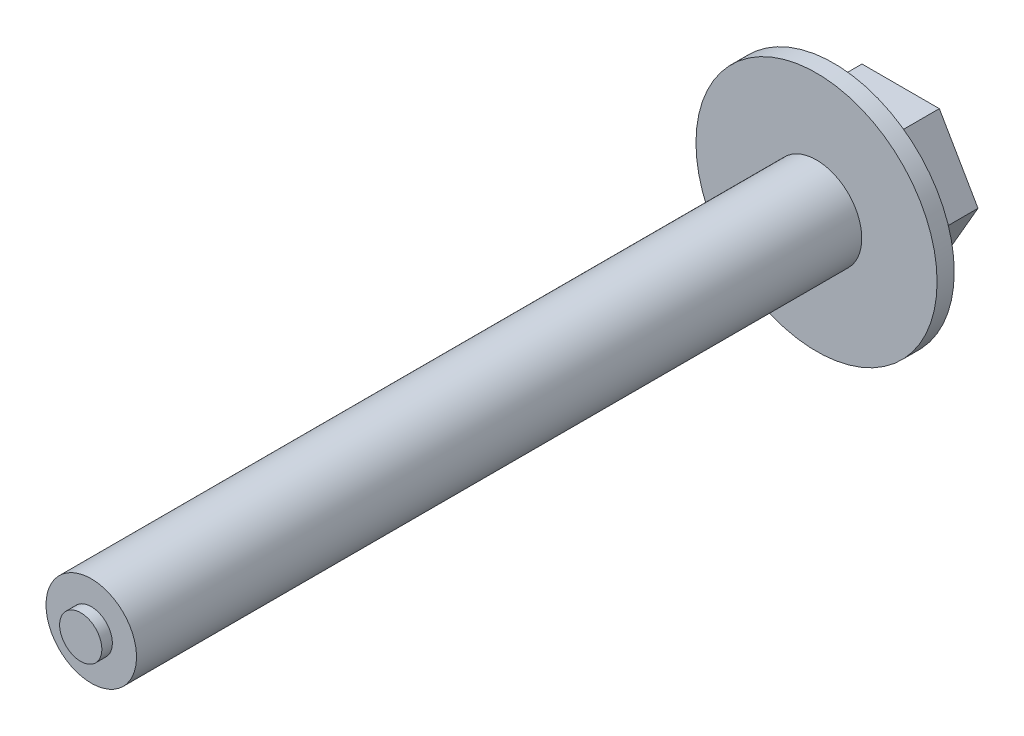
ISO-10303-21;
HEADER;
FILE_DESCRIPTION(('STEP AP214'),'2;1');
FILE_NAME('part.step','',(''),(''),'','','');
FILE_SCHEMA(('AUTOMOTIVE_DESIGN { 1 0 10303 214 1 1 1 1 }'));
ENDSEC;
DATA;
#1=APPLICATION_CONTEXT('core data for automotive mechanical design processes');
#2=APPLICATION_PROTOCOL_DEFINITION('international standard','automotive_design',2000,#1);
#3=PRODUCT_CONTEXT('',#1,'mechanical');
#4=PRODUCT('Part','Part','',(#3));
#5=PRODUCT_RELATED_PRODUCT_CATEGORY('part','',(#4));
#6=PRODUCT_DEFINITION_FORMATION('','',#4);
#7=PRODUCT_DEFINITION_CONTEXT('part definition',#1,'design');
#8=PRODUCT_DEFINITION('design','',#6,#7);
#9=PRODUCT_DEFINITION_SHAPE('','',#8);
#10=(LENGTH_UNIT() NAMED_UNIT(*) SI_UNIT(.MILLI.,.METRE.));
#11=(NAMED_UNIT(*) PLANE_ANGLE_UNIT() SI_UNIT($,.RADIAN.));
#12=(NAMED_UNIT(*) SI_UNIT($,.STERADIAN.) SOLID_ANGLE_UNIT());
#13=UNCERTAINTY_MEASURE_WITH_UNIT(LENGTH_MEASURE(1.E-05),#10,'distance_accuracy_value','');
#14=(GEOMETRIC_REPRESENTATION_CONTEXT(3) GLOBAL_UNCERTAINTY_ASSIGNED_CONTEXT((#13)) GLOBAL_UNIT_ASSIGNED_CONTEXT((#10,
#11,#12)) REPRESENTATION_CONTEXT('',''));
#15=CARTESIAN_POINT('',(0.,0.,0.));
#16=DIRECTION('',(0.,0.,1.));
#17=DIRECTION('',(1.,0.,0.));
#18=AXIS2_PLACEMENT_3D('',#15,#16,#17);
#19=CARTESIAN_POINT('',(1.8330871046771,-3.17499999999998,3.175));
#20=DIRECTION('',(-0.866025403784441,0.499999999999995,0.));
#21=DIRECTION('',(-0.499999999999995,-0.866025403784441,0.));
#22=AXIS2_PLACEMENT_3D('',#19,#20,#21);
#23=PLANE('',#22);
#24=DIRECTION('',(0.499999999999995,0.866025403784441,0.));
#25=VECTOR('',#24,1.);
#26=CARTESIAN_POINT('',(1.8330871046771,-3.17499999999998,0.));
#27=LINE('',#26,#25);
#28=CARTESIAN_POINT('',(1.8330871046771,-3.17499999999998,0.));
#29=VERTEX_POINT('',#28);
#30=CARTESIAN_POINT('',(3.66617420935413,0.,0.));
#31=VERTEX_POINT('',#30);
#32=EDGE_CURVE('E143',#29,#31,#27,.T.);
#33=ORIENTED_EDGE('',*,*,#32,.T.);
#34=DIRECTION('',(0.,0.,-1.));
#35=VECTOR('',#34,1.);
#36=CARTESIAN_POINT('',(3.66617420935413,0.,3.175));
#37=LINE('',#36,#35);
#38=CARTESIAN_POINT('',(3.66617420935413,0.,3.175));
#39=VERTEX_POINT('',#38);
#40=EDGE_CURVE('E11',#39,#31,#37,.T.);
#41=ORIENTED_EDGE('',*,*,#40,.F.);
#42=DIRECTION('',(0.499999999999995,0.866025403784441,0.));
#43=VECTOR('',#42,1.);
#44=CARTESIAN_POINT('',(1.8330871046771,-3.17499999999998,3.175));
#45=LINE('',#44,#43);
#46=CARTESIAN_POINT('',(1.8330871046771,-3.17499999999998,3.175));
#47=VERTEX_POINT('',#46);
#48=EDGE_CURVE('E133',#47,#39,#45,.T.);
#49=ORIENTED_EDGE('',*,*,#48,.F.);
#50=DIRECTION('',(0.,0.,-1.));
#51=VECTOR('',#50,1.);
#52=CARTESIAN_POINT('',(1.8330871046771,-3.17499999999998,3.175));
#53=LINE('',#52,#51);
#54=EDGE_CURVE('E142',#47,#29,#53,.T.);
#55=ORIENTED_EDGE('',*,*,#54,.T.);
#56=EDGE_LOOP('',(#33,#41,#49,#55));
#57=FACE_BOUND('',#56,.T.);
#58=ADVANCED_FACE('F44',(#57),#23,.F.);
#59=CARTESIAN_POINT('',(3.66617420935413,0.,3.175));
#60=DIRECTION('',(-0.866025403784438,-0.500000000000001,0.));
#61=DIRECTION('',(0.500000000000001,-0.866025403784438,0.));
#62=AXIS2_PLACEMENT_3D('',#59,#60,#61);
#63=PLANE('',#62);
#64=DIRECTION('',(-0.500000000000001,0.866025403784438,0.));
#65=VECTOR('',#64,1.);
#66=CARTESIAN_POINT('',(3.66617420935413,0.,0.));
#67=LINE('',#66,#65);
#68=CARTESIAN_POINT('',(1.83308710467706,3.17500000000001,0.));
#69=VERTEX_POINT('',#68);
#70=EDGE_CURVE('E147',#31,#69,#67,.T.);
#71=ORIENTED_EDGE('',*,*,#70,.T.);
#72=DIRECTION('',(0.,0.,-1.));
#73=VECTOR('',#72,1.);
#74=CARTESIAN_POINT('',(1.83308710467706,3.17500000000001,3.175));
#75=LINE('',#74,#73);
#76=CARTESIAN_POINT('',(1.83308710467706,3.17500000000001,3.175));
#77=VERTEX_POINT('',#76);
#78=EDGE_CURVE('E54',#77,#69,#75,.T.);
#79=ORIENTED_EDGE('',*,*,#78,.F.);
#80=DIRECTION('',(-0.500000000000001,0.866025403784438,0.));
#81=VECTOR('',#80,1.);
#82=CARTESIAN_POINT('',(3.66617420935413,0.,3.175));
#83=LINE('',#82,#81);
#84=EDGE_CURVE('E98',#39,#77,#83,.T.);
#85=ORIENTED_EDGE('',*,*,#84,.F.);
#86=ORIENTED_EDGE('',*,*,#40,.T.);
#87=EDGE_LOOP('',(#71,#79,#85,#86));
#88=FACE_BOUND('',#87,.T.);
#89=ADVANCED_FACE('F215',(#88),#63,.F.);
#90=CARTESIAN_POINT('',(1.83308710467706,3.17500000000001,3.175));
#91=DIRECTION('',(0.,-1.,0.));
#92=DIRECTION('',(1.,0.,0.));
#93=AXIS2_PLACEMENT_3D('',#90,#91,#92);
#94=PLANE('',#93);
#95=DIRECTION('',(-1.,0.,0.));
#96=VECTOR('',#95,1.);
#97=CARTESIAN_POINT('',(1.83308710467706,3.17500000000001,0.));
#98=LINE('',#97,#96);
#99=CARTESIAN_POINT('',(-1.83308710467708,3.17499999999999,0.));
#100=VERTEX_POINT('',#99);
#101=EDGE_CURVE('E113',#69,#100,#98,.T.);
#102=ORIENTED_EDGE('',*,*,#101,.T.);
#103=DIRECTION('',(0.,0.,-1.));
#104=VECTOR('',#103,1.);
#105=CARTESIAN_POINT('',(-1.83308710467708,3.17499999999999,3.175));
#106=LINE('',#105,#104);
#107=CARTESIAN_POINT('',(-1.83308710467708,3.17499999999999,3.175));
#108=VERTEX_POINT('',#107);
#109=EDGE_CURVE('E106',#108,#100,#106,.T.);
#110=ORIENTED_EDGE('',*,*,#109,.F.);
#111=DIRECTION('',(-1.,0.,0.));
#112=VECTOR('',#111,1.);
#113=CARTESIAN_POINT('',(1.83308710467706,3.17500000000001,3.175));
#114=LINE('',#113,#112);
#115=EDGE_CURVE('E111',#77,#108,#114,.T.);
#116=ORIENTED_EDGE('',*,*,#115,.F.);
#117=ORIENTED_EDGE('',*,*,#78,.T.);
#118=EDGE_LOOP('',(#102,#110,#116,#117));
#119=FACE_BOUND('',#118,.T.);
#120=ADVANCED_FACE('F108',(#119),#94,.F.);
#121=CARTESIAN_POINT('',(-1.83308710467708,3.17499999999999,3.175));
#122=DIRECTION('',(0.866025403784441,-0.499999999999995,0.));
#123=DIRECTION('',(0.499999999999995,0.866025403784442,0.));
#124=AXIS2_PLACEMENT_3D('',#121,#122,#123);
#125=PLANE('',#124);
#126=DIRECTION('',(-0.499999999999995,-0.866025403784441,0.));
#127=VECTOR('',#126,1.);
#128=CARTESIAN_POINT('',(-1.83308710467708,3.17499999999999,0.));
#129=LINE('',#128,#127);
#130=CARTESIAN_POINT('',(-3.66617420935413,0.,0.));
#131=VERTEX_POINT('',#130);
#132=EDGE_CURVE('E153',#100,#131,#129,.T.);
#133=ORIENTED_EDGE('',*,*,#132,.T.);
#134=DIRECTION('',(0.,0.,-1.));
#135=VECTOR('',#134,1.);
#136=CARTESIAN_POINT('',(-3.66617420935413,0.,3.175));
#137=LINE('',#136,#135);
#138=CARTESIAN_POINT('',(-3.66617420935413,0.,3.175));
#139=VERTEX_POINT('',#138);
#140=EDGE_CURVE('E117',#139,#131,#137,.T.);
#141=ORIENTED_EDGE('',*,*,#140,.F.);
#142=DIRECTION('',(-0.499999999999995,-0.866025403784441,0.));
#143=VECTOR('',#142,1.);
#144=CARTESIAN_POINT('',(-1.83308710467708,3.17499999999999,3.175));
#145=LINE('',#144,#143);
#146=EDGE_CURVE('E120',#108,#139,#145,.T.);
#147=ORIENTED_EDGE('',*,*,#146,.F.);
#148=ORIENTED_EDGE('',*,*,#109,.T.);
#149=EDGE_LOOP('',(#133,#141,#147,#148));
#150=FACE_BOUND('',#149,.T.);
#151=ADVANCED_FACE('F121',(#150),#125,.F.);
#152=CARTESIAN_POINT('',(-3.66617420935413,0.,3.175));
#153=DIRECTION('',(0.866025403784435,0.500000000000007,0.));
#154=DIRECTION('',(-0.500000000000007,0.866025403784435,0.));
#155=AXIS2_PLACEMENT_3D('',#152,#153,#154);
#156=PLANE('',#155);
#157=DIRECTION('',(0.500000000000007,-0.866025403784435,0.));
#158=VECTOR('',#157,1.);
#159=CARTESIAN_POINT('',(-3.66617420935413,0.,0.));
#160=LINE('',#159,#158);
#161=CARTESIAN_POINT('',(-1.83308710467703,-3.17500000000002,0.));
#162=VERTEX_POINT('',#161);
#163=EDGE_CURVE('E84',#131,#162,#160,.T.);
#164=ORIENTED_EDGE('',*,*,#163,.T.);
#165=DIRECTION('',(0.,0.,-1.));
#166=VECTOR('',#165,1.);
#167=CARTESIAN_POINT('',(-1.83308710467703,-3.17500000000002,3.175));
#168=LINE('',#167,#166);
#169=CARTESIAN_POINT('',(-1.83308710467703,-3.17500000000002,3.175));
#170=VERTEX_POINT('',#169);
#171=EDGE_CURVE('E62',#170,#162,#168,.T.);
#172=ORIENTED_EDGE('',*,*,#171,.F.);
#173=DIRECTION('',(0.500000000000007,-0.866025403784435,0.));
#174=VECTOR('',#173,1.);
#175=CARTESIAN_POINT('',(-3.66617420935413,0.,3.175));
#176=LINE('',#175,#174);
#177=EDGE_CURVE('E125',#139,#170,#176,.T.);
#178=ORIENTED_EDGE('',*,*,#177,.F.);
#179=ORIENTED_EDGE('',*,*,#140,.T.);
#180=EDGE_LOOP('',(#164,#172,#178,#179));
#181=FACE_BOUND('',#180,.T.);
#182=ADVANCED_FACE('F170',(#181),#156,.F.);
#183=CARTESIAN_POINT('',(-1.83308710467703,-3.17500000000002,3.175));
#184=DIRECTION('',(0.,1.,0.));
#185=DIRECTION('',(-1.,0.,0.));
#186=AXIS2_PLACEMENT_3D('',#183,#184,#185);
#187=PLANE('',#186);
#188=DIRECTION('',(1.,0.,0.));
#189=VECTOR('',#188,1.);
#190=CARTESIAN_POINT('',(-1.83308710467703,-3.17500000000002,0.));
#191=LINE('',#190,#189);
#192=EDGE_CURVE('E90',#162,#29,#191,.T.);
#193=ORIENTED_EDGE('',*,*,#192,.T.);
#194=ORIENTED_EDGE('',*,*,#54,.F.);
#195=DIRECTION('',(1.,0.,0.));
#196=VECTOR('',#195,1.);
#197=CARTESIAN_POINT('',(-1.83308710467703,-3.17500000000002,3.175));
#198=LINE('',#197,#196);
#199=EDGE_CURVE('E139',#170,#47,#198,.T.);
#200=ORIENTED_EDGE('',*,*,#199,.F.);
#201=ORIENTED_EDGE('',*,*,#171,.T.);
#202=EDGE_LOOP('',(#193,#194,#200,#201));
#203=FACE_BOUND('',#202,.T.);
#204=ADVANCED_FACE('F172',(#203),#187,.F.);
#205=CARTESIAN_POINT('',(0.,0.,0.));
#206=DIRECTION('',(0.,0.,1.));
#207=DIRECTION('',(1.,0.,0.));
#208=AXIS2_PLACEMENT_3D('',#205,#206,#207);
#209=PLANE('',#208);
#210=ORIENTED_EDGE('',*,*,#32,.F.);
#211=ORIENTED_EDGE('',*,*,#192,.F.);
#212=ORIENTED_EDGE('',*,*,#163,.F.);
#213=ORIENTED_EDGE('',*,*,#132,.F.);
#214=ORIENTED_EDGE('',*,*,#101,.F.);
#215=ORIENTED_EDGE('',*,*,#70,.F.);
#216=EDGE_LOOP('',(#210,#211,#212,#213,#214,#215));
#217=FACE_BOUND('',#216,.T.);
#218=ADVANCED_FACE('F169',(#217),#209,.F.);
#219=CARTESIAN_POINT('',(0.,0.,3.175));
#220=DIRECTION('',(0.,0.,1.));
#221=DIRECTION('',(1.,0.,0.));
#222=AXIS2_PLACEMENT_3D('',#219,#220,#221);
#223=PLANE('',#222);
#224=CARTESIAN_POINT('',(0.,0.,3.175));
#225=DIRECTION('',(0.,0.,1.));
#226=DIRECTION('',(1.,0.,0.));
#227=AXIS2_PLACEMENT_3D('',#224,#225,#226);
#228=CIRCLE('',#227,5.715);
#229=CARTESIAN_POINT('',(5.715,0.,3.175));
#230=VERTEX_POINT('',#229);
#231=EDGE_CURVE('E176',#230,#230,#228,.T.);
#232=ORIENTED_EDGE('',*,*,#231,.F.);
#233=EDGE_LOOP('',(#232));
#234=FACE_BOUND('',#233,.T.);
#235=ORIENTED_EDGE('',*,*,#199,.T.);
#236=ORIENTED_EDGE('',*,*,#48,.T.);
#237=ORIENTED_EDGE('',*,*,#84,.T.);
#238=ORIENTED_EDGE('',*,*,#115,.T.);
#239=ORIENTED_EDGE('',*,*,#146,.T.);
#240=ORIENTED_EDGE('',*,*,#177,.T.);
#241=EDGE_LOOP('',(#235,#236,#237,#238,#239,#240));
#242=FACE_BOUND('',#241,.T.);
#243=ADVANCED_FACE('F128',(#234,#242),#223,.F.);
#244=CARTESIAN_POINT('',(0.,0.,3.9878));
#245=DIRECTION('',(0.,0.,-1.));
#246=DIRECTION('',(-1.,0.,0.));
#247=AXIS2_PLACEMENT_3D('',#244,#245,#246);
#248=CYLINDRICAL_SURFACE('',#247,5.715);
#249=CARTESIAN_POINT('',(0.,0.,3.9878));
#250=DIRECTION('',(0.,0.,1.));
#251=DIRECTION('',(1.,0.,0.));
#252=AXIS2_PLACEMENT_3D('',#249,#250,#251);
#253=CIRCLE('',#252,5.715);
#254=CARTESIAN_POINT('',(5.715,0.,3.9878));
#255=VERTEX_POINT('',#254);
#256=EDGE_CURVE('E148',#255,#255,#253,.T.);
#257=ORIENTED_EDGE('',*,*,#256,.F.);
#258=EDGE_LOOP('',(#257));
#259=FACE_BOUND('',#258,.T.);
#260=ORIENTED_EDGE('',*,*,#231,.T.);
#261=EDGE_LOOP('',(#260));
#262=FACE_BOUND('',#261,.T.);
#263=ADVANCED_FACE('F232',(#259,#262),#248,.T.);
#264=CARTESIAN_POINT('',(0.,0.,3.9878));
#265=DIRECTION('',(0.,0.,1.));
#266=DIRECTION('',(1.,0.,0.));
#267=AXIS2_PLACEMENT_3D('',#264,#265,#266);
#268=PLANE('',#267);
#269=CARTESIAN_POINT('',(0.,0.,3.9878));
#270=DIRECTION('',(0.,0.,-1.));
#271=DIRECTION('',(-1.,0.,0.));
#272=AXIS2_PLACEMENT_3D('',#269,#270,#271);
#273=CIRCLE('',#272,2.145);
#274=CARTESIAN_POINT('',(-2.145,0.,3.9878));
#275=VERTEX_POINT('',#274);
#276=EDGE_CURVE('E180',#275,#275,#273,.T.);
#277=ORIENTED_EDGE('',*,*,#276,.T.);
#278=EDGE_LOOP('',(#277));
#279=FACE_BOUND('',#278,.T.);
#280=ORIENTED_EDGE('',*,*,#256,.T.);
#281=EDGE_LOOP('',(#280));
#282=FACE_BOUND('',#281,.T.);
#283=ADVANCED_FACE('F235',(#279,#282),#268,.T.);
#284=CARTESIAN_POINT('',(0.,0.,3.9878));
#285=DIRECTION('',(0.,0.,-1.));
#286=DIRECTION('',(-1.,0.,0.));
#287=AXIS2_PLACEMENT_3D('',#284,#285,#286);
#288=CYLINDRICAL_SURFACE('',#287,2.145);
#289=CARTESIAN_POINT('',(0.,0.,38.3678));
#290=DIRECTION('',(0.,0.,-1.));
#291=DIRECTION('',(-1.,0.,0.));
#292=AXIS2_PLACEMENT_3D('',#289,#290,#291);
#293=CIRCLE('',#292,2.145);
#294=CARTESIAN_POINT('',(-2.145,0.,38.3678));
#295=VERTEX_POINT('',#294);
#296=EDGE_CURVE('E187',#295,#295,#293,.T.);
#297=ORIENTED_EDGE('',*,*,#296,.T.);
#298=EDGE_LOOP('',(#297));
#299=FACE_BOUND('',#298,.T.);
#300=ORIENTED_EDGE('',*,*,#276,.F.);
#301=EDGE_LOOP('',(#300));
#302=FACE_BOUND('',#301,.T.);
#303=ADVANCED_FACE('F212',(#299,#302),#288,.T.);
#304=CARTESIAN_POINT('',(0.,2.145,38.3678));
#305=DIRECTION('',(0.,0.,1.));
#306=DIRECTION('',(1.,0.,0.));
#307=AXIS2_PLACEMENT_3D('',#304,#305,#306);
#308=PLANE('',#307);
#309=CARTESIAN_POINT('',(0.,0.,38.3678));
#310=DIRECTION('',(0.,0.,-1.));
#311=DIRECTION('',(-1.,0.,0.));
#312=AXIS2_PLACEMENT_3D('',#309,#310,#311);
#313=CIRCLE('',#312,0.999999999999996);
#314=CARTESIAN_POINT('',(-0.999999999999996,0.,38.3678));
#315=VERTEX_POINT('',#314);
#316=EDGE_CURVE('E191',#315,#315,#313,.T.);
#317=ORIENTED_EDGE('',*,*,#316,.T.);
#318=EDGE_LOOP('',(#317));
#319=FACE_BOUND('',#318,.T.);
#320=ORIENTED_EDGE('',*,*,#296,.F.);
#321=EDGE_LOOP('',(#320));
#322=FACE_BOUND('',#321,.T.);
#323=ADVANCED_FACE('F205',(#319,#322),#308,.T.);
#324=CARTESIAN_POINT('',(0.,0.,3.9878));
#325=DIRECTION('',(0.,0.,-1.));
#326=DIRECTION('',(-1.,0.,0.));
#327=AXIS2_PLACEMENT_3D('',#324,#325,#326);
#328=CYLINDRICAL_SURFACE('',#327,0.999999999999996);
#329=CARTESIAN_POINT('',(0.,0.,38.8678));
#330=DIRECTION('',(0.,0.,-1.));
#331=DIRECTION('',(-1.,0.,0.));
#332=AXIS2_PLACEMENT_3D('',#329,#330,#331);
#333=CIRCLE('',#332,0.999999999999996);
#334=CARTESIAN_POINT('',(-0.999999999999996,0.,38.8678));
#335=VERTEX_POINT('',#334);
#336=EDGE_CURVE('E47',#335,#335,#333,.F.);
#337=ORIENTED_EDGE('',*,*,#336,.F.);
#338=EDGE_LOOP('',(#337));
#339=FACE_BOUND('',#338,.T.);
#340=ORIENTED_EDGE('',*,*,#316,.F.);
#341=EDGE_LOOP('',(#340));
#342=FACE_BOUND('',#341,.T.);
#343=ADVANCED_FACE('F202',(#339,#342),#328,.T.);
#344=CARTESIAN_POINT('',(-5.715,3.,38.8678));
#345=DIRECTION('',(0.,0.,-1.));
#346=DIRECTION('',(-1.,0.,0.));
#347=AXIS2_PLACEMENT_3D('',#344,#345,#346);
#348=PLANE('',#347);
#349=ORIENTED_EDGE('',*,*,#336,.T.);
#350=EDGE_LOOP('',(#349));
#351=FACE_BOUND('',#350,.T.);
#352=ADVANCED_FACE('F200',(#351),#348,.F.);
#353=CLOSED_SHELL('',(#58,#89,#120,#151,#182,#204,#218,#243,#263,#283,#303,#323,#343,#352));
#354=MANIFOLD_SOLID_BREP('B2',#353);
#355=ADVANCED_BREP_SHAPE_REPRESENTATION('',(#18,#354),#14);
#356=SHAPE_DEFINITION_REPRESENTATION(#9,#355);
ENDSEC;
END-ISO-10303-21;
